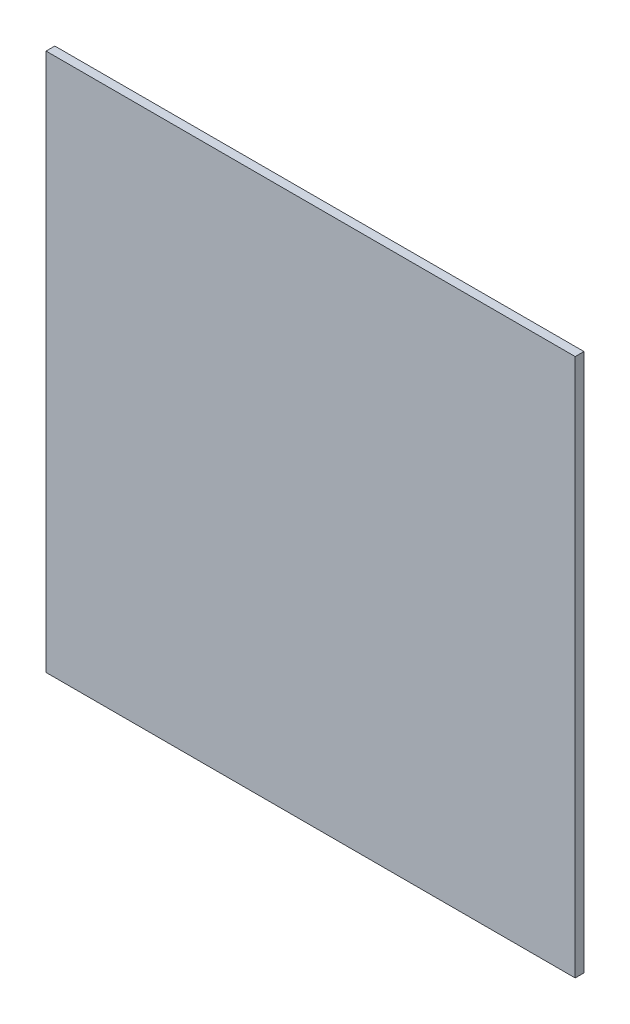
ISO-10303-21;
HEADER;
FILE_DESCRIPTION(('STEP AP214'),'2;1');
FILE_NAME('part.step','',(''),(''),'','','');
FILE_SCHEMA(('AUTOMOTIVE_DESIGN { 1 0 10303 214 1 1 1 1 }'));
ENDSEC;
DATA;
#1=APPLICATION_CONTEXT('core data for automotive mechanical design processes');
#2=APPLICATION_PROTOCOL_DEFINITION('international standard','automotive_design',2000,#1);
#3=PRODUCT_CONTEXT('',#1,'mechanical');
#4=PRODUCT('Part','Part','',(#3));
#5=PRODUCT_RELATED_PRODUCT_CATEGORY('part','',(#4));
#6=PRODUCT_DEFINITION_FORMATION('','',#4);
#7=PRODUCT_DEFINITION_CONTEXT('part definition',#1,'design');
#8=PRODUCT_DEFINITION('design','',#6,#7);
#9=PRODUCT_DEFINITION_SHAPE('','',#8);
#10=(LENGTH_UNIT() NAMED_UNIT(*) SI_UNIT(.MILLI.,.METRE.));
#11=(NAMED_UNIT(*) PLANE_ANGLE_UNIT() SI_UNIT($,.RADIAN.));
#12=(NAMED_UNIT(*) SI_UNIT($,.STERADIAN.) SOLID_ANGLE_UNIT());
#13=UNCERTAINTY_MEASURE_WITH_UNIT(LENGTH_MEASURE(1.E-05),#10,'distance_accuracy_value','');
#14=(GEOMETRIC_REPRESENTATION_CONTEXT(3) GLOBAL_UNCERTAINTY_ASSIGNED_CONTEXT((#13)) GLOBAL_UNIT_ASSIGNED_CONTEXT((#10,
#11,#12)) REPRESENTATION_CONTEXT('',''));
#15=CARTESIAN_POINT('',(0.,0.,0.));
#16=DIRECTION('',(0.,0.,1.));
#17=DIRECTION('',(1.,0.,0.));
#18=AXIS2_PLACEMENT_3D('',#15,#16,#17);
#19=CARTESIAN_POINT('',(-302.35,-307.5,10.));
#20=DIRECTION('',(1.,0.,0.));
#21=DIRECTION('',(0.,0.,-1.));
#22=AXIS2_PLACEMENT_3D('',#19,#20,#21);
#23=PLANE('',#22);
#24=DIRECTION('',(0.,-1.,0.));
#25=VECTOR('',#24,1.);
#26=CARTESIAN_POINT('',(-302.35,-307.5,0.));
#27=LINE('',#26,#25);
#28=CARTESIAN_POINT('',(-302.35,307.5,0.));
#29=VERTEX_POINT('',#28);
#30=CARTESIAN_POINT('',(-302.35,-307.5,0.));
#31=VERTEX_POINT('',#30);
#32=EDGE_CURVE('E105',#29,#31,#27,.T.);
#33=ORIENTED_EDGE('',*,*,#32,.T.);
#34=DIRECTION('',(0.,0.,-1.));
#35=VECTOR('',#34,1.);
#36=CARTESIAN_POINT('',(-302.35,-307.5,10.));
#37=LINE('',#36,#35);
#38=CARTESIAN_POINT('',(-302.35,-307.5,10.));
#39=VERTEX_POINT('',#38);
#40=EDGE_CURVE('E11',#39,#31,#37,.T.);
#41=ORIENTED_EDGE('',*,*,#40,.F.);
#42=DIRECTION('',(0.,-1.,0.));
#43=VECTOR('',#42,1.);
#44=CARTESIAN_POINT('',(-302.35,-307.5,10.));
#45=LINE('',#44,#43);
#46=CARTESIAN_POINT('',(-302.35,307.5,10.));
#47=VERTEX_POINT('',#46);
#48=EDGE_CURVE('E89',#47,#39,#45,.T.);
#49=ORIENTED_EDGE('',*,*,#48,.F.);
#50=DIRECTION('',(0.,0.,-1.));
#51=VECTOR('',#50,1.);
#52=CARTESIAN_POINT('',(-302.35,307.5,10.));
#53=LINE('',#52,#51);
#54=EDGE_CURVE('E97',#47,#29,#53,.T.);
#55=ORIENTED_EDGE('',*,*,#54,.T.);
#56=EDGE_LOOP('',(#33,#41,#49,#55));
#57=FACE_BOUND('',#56,.T.);
#58=ADVANCED_FACE('F39',(#57),#23,.F.);
#59=CARTESIAN_POINT('',(302.35,-307.5,10.));
#60=DIRECTION('',(0.,1.,0.));
#61=DIRECTION('',(-1.,0.,0.));
#62=AXIS2_PLACEMENT_3D('',#59,#60,#61);
#63=PLANE('',#62);
#64=DIRECTION('',(1.,0.,0.));
#65=VECTOR('',#64,1.);
#66=CARTESIAN_POINT('',(302.35,-307.5,0.));
#67=LINE('',#66,#65);
#68=CARTESIAN_POINT('',(302.35,-307.5,0.));
#69=VERTEX_POINT('',#68);
#70=EDGE_CURVE('E92',#31,#69,#67,.T.);
#71=ORIENTED_EDGE('',*,*,#70,.T.);
#72=DIRECTION('',(0.,0.,-1.));
#73=VECTOR('',#72,1.);
#74=CARTESIAN_POINT('',(302.35,-307.5,10.));
#75=LINE('',#74,#73);
#76=CARTESIAN_POINT('',(302.35,-307.5,10.));
#77=VERTEX_POINT('',#76);
#78=EDGE_CURVE('E50',#77,#69,#75,.T.);
#79=ORIENTED_EDGE('',*,*,#78,.F.);
#80=DIRECTION('',(1.,0.,0.));
#81=VECTOR('',#80,1.);
#82=CARTESIAN_POINT('',(302.35,-307.5,10.));
#83=LINE('',#82,#81);
#84=EDGE_CURVE('E82',#39,#77,#83,.T.);
#85=ORIENTED_EDGE('',*,*,#84,.F.);
#86=ORIENTED_EDGE('',*,*,#40,.T.);
#87=EDGE_LOOP('',(#71,#79,#85,#86));
#88=FACE_BOUND('',#87,.T.);
#89=ADVANCED_FACE('F93',(#88),#63,.F.);
#90=CARTESIAN_POINT('',(302.35,-307.5,10.));
#91=DIRECTION('',(-1.,0.,0.));
#92=DIRECTION('',(0.,0.,1.));
#93=AXIS2_PLACEMENT_3D('',#90,#91,#92);
#94=PLANE('',#93);
#95=DIRECTION('',(0.,1.,0.));
#96=VECTOR('',#95,1.);
#97=CARTESIAN_POINT('',(302.35,-307.5,0.));
#98=LINE('',#97,#96);
#99=CARTESIAN_POINT('',(302.35,307.5,0.));
#100=VERTEX_POINT('',#99);
#101=EDGE_CURVE('E75',#69,#100,#98,.T.);
#102=ORIENTED_EDGE('',*,*,#101,.T.);
#103=DIRECTION('',(0.,0.,-1.));
#104=VECTOR('',#103,1.);
#105=CARTESIAN_POINT('',(302.35,307.5,10.));
#106=LINE('',#105,#104);
#107=CARTESIAN_POINT('',(302.35,307.5,10.));
#108=VERTEX_POINT('',#107);
#109=EDGE_CURVE('E94',#108,#100,#106,.T.);
#110=ORIENTED_EDGE('',*,*,#109,.F.);
#111=DIRECTION('',(0.,1.,0.));
#112=VECTOR('',#111,1.);
#113=CARTESIAN_POINT('',(302.35,-307.5,10.));
#114=LINE('',#113,#112);
#115=EDGE_CURVE('E88',#77,#108,#114,.T.);
#116=ORIENTED_EDGE('',*,*,#115,.F.);
#117=ORIENTED_EDGE('',*,*,#78,.T.);
#118=EDGE_LOOP('',(#102,#110,#116,#117));
#119=FACE_BOUND('',#118,.T.);
#120=ADVANCED_FACE('F96',(#119),#94,.F.);
#121=CARTESIAN_POINT('',(302.35,307.5,10.));
#122=DIRECTION('',(0.,-1.,0.));
#123=DIRECTION('',(1.,0.,0.));
#124=AXIS2_PLACEMENT_3D('',#121,#122,#123);
#125=PLANE('',#124);
#126=DIRECTION('',(-1.,0.,0.));
#127=VECTOR('',#126,1.);
#128=CARTESIAN_POINT('',(302.35,307.5,0.));
#129=LINE('',#128,#127);
#130=EDGE_CURVE('E76',#100,#29,#129,.T.);
#131=ORIENTED_EDGE('',*,*,#130,.T.);
#132=ORIENTED_EDGE('',*,*,#54,.F.);
#133=DIRECTION('',(-1.,0.,0.));
#134=VECTOR('',#133,1.);
#135=CARTESIAN_POINT('',(302.35,307.5,10.));
#136=LINE('',#135,#134);
#137=EDGE_CURVE('E54',#108,#47,#136,.T.);
#138=ORIENTED_EDGE('',*,*,#137,.F.);
#139=ORIENTED_EDGE('',*,*,#109,.T.);
#140=EDGE_LOOP('',(#131,#132,#138,#139));
#141=FACE_BOUND('',#140,.T.);
#142=ADVANCED_FACE('F109',(#141),#125,.F.);
#143=CARTESIAN_POINT('',(0.,0.,10.));
#144=DIRECTION('',(0.,0.,1.));
#145=DIRECTION('',(1.,0.,0.));
#146=AXIS2_PLACEMENT_3D('',#143,#144,#145);
#147=PLANE('',#146);
#148=ORIENTED_EDGE('',*,*,#48,.T.);
#149=ORIENTED_EDGE('',*,*,#84,.T.);
#150=ORIENTED_EDGE('',*,*,#115,.T.);
#151=ORIENTED_EDGE('',*,*,#137,.T.);
#152=EDGE_LOOP('',(#148,#149,#150,#151));
#153=FACE_BOUND('',#152,.T.);
#154=ADVANCED_FACE('F86',(#153),#147,.T.);
#155=CARTESIAN_POINT('',(0.,0.,0.));
#156=DIRECTION('',(0.,0.,1.));
#157=DIRECTION('',(1.,0.,0.));
#158=AXIS2_PLACEMENT_3D('',#155,#156,#157);
#159=PLANE('',#158);
#160=ORIENTED_EDGE('',*,*,#32,.F.);
#161=ORIENTED_EDGE('',*,*,#130,.F.);
#162=ORIENTED_EDGE('',*,*,#101,.F.);
#163=ORIENTED_EDGE('',*,*,#70,.F.);
#164=EDGE_LOOP('',(#160,#161,#162,#163));
#165=FACE_BOUND('',#164,.T.);
#166=ADVANCED_FACE('F115',(#165),#159,.F.);
#167=CLOSED_SHELL('',(#58,#89,#120,#142,#154,#166));
#168=MANIFOLD_SOLID_BREP('B2',#167);
#169=ADVANCED_BREP_SHAPE_REPRESENTATION('',(#18,#168),#14);
#170=SHAPE_DEFINITION_REPRESENTATION(#9,#169);
ENDSEC;
END-ISO-10303-21;
